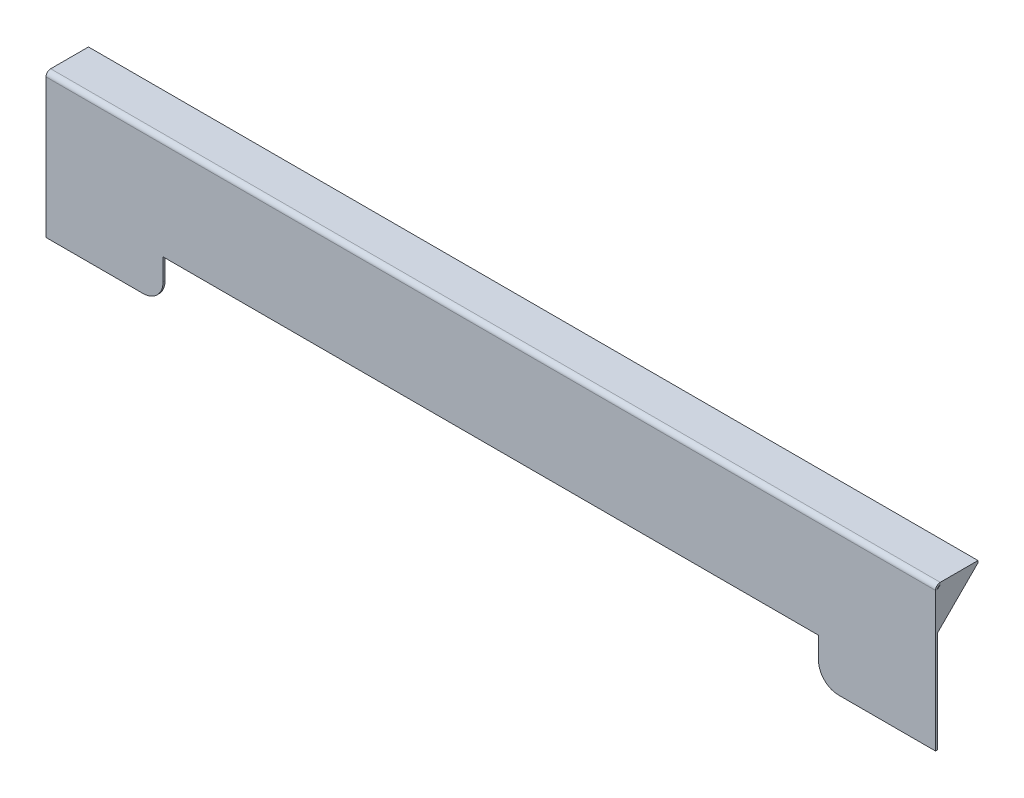
ISO-10303-21;
HEADER;
FILE_DESCRIPTION(('STEP AP214'),'2;1');
FILE_NAME('part.step','',(''),(''),'','','');
FILE_SCHEMA(('AUTOMOTIVE_DESIGN { 1 0 10303 214 1 1 1 1 }'));
ENDSEC;
DATA;
#1=APPLICATION_CONTEXT('core data for automotive mechanical design processes');
#2=APPLICATION_PROTOCOL_DEFINITION('international standard','automotive_design',2000,#1);
#3=PRODUCT_CONTEXT('',#1,'mechanical');
#4=PRODUCT('Part','Part','',(#3));
#5=PRODUCT_RELATED_PRODUCT_CATEGORY('part','',(#4));
#6=PRODUCT_DEFINITION_FORMATION('','',#4);
#7=PRODUCT_DEFINITION_CONTEXT('part definition',#1,'design');
#8=PRODUCT_DEFINITION('design','',#6,#7);
#9=PRODUCT_DEFINITION_SHAPE('','',#8);
#10=(LENGTH_UNIT() NAMED_UNIT(*) SI_UNIT(.MILLI.,.METRE.));
#11=(NAMED_UNIT(*) PLANE_ANGLE_UNIT() SI_UNIT($,.RADIAN.));
#12=(NAMED_UNIT(*) SI_UNIT($,.STERADIAN.) SOLID_ANGLE_UNIT());
#13=UNCERTAINTY_MEASURE_WITH_UNIT(LENGTH_MEASURE(1.E-05),#10,'distance_accuracy_value','');
#14=(GEOMETRIC_REPRESENTATION_CONTEXT(3) GLOBAL_UNCERTAINTY_ASSIGNED_CONTEXT((#13)) GLOBAL_UNIT_ASSIGNED_CONTEXT((#10,
#11,#12)) REPRESENTATION_CONTEXT('',''));
#15=CARTESIAN_POINT('',(0.,0.,0.));
#16=DIRECTION('',(0.,0.,1.));
#17=DIRECTION('',(1.,0.,0.));
#18=AXIS2_PLACEMENT_3D('',#15,#16,#17);
#19=CARTESIAN_POINT('',(0.,59.8,2.09887204035541E-13));
#20=DIRECTION('',(0.,-1.,0.));
#21=DIRECTION('',(0.,0.,-1.));
#22=AXIS2_PLACEMENT_3D('',#19,#20,#21);
#23=PLANE('',#22);
#24=DIRECTION('',(1.,0.,0.));
#25=VECTOR('',#24,1.);
#26=CARTESIAN_POINT('',(-266.,59.8000000000001,-23.5));
#27=LINE('',#26,#25);
#28=CARTESIAN_POINT('',(264.4,59.8000000000001,-23.5));
#29=VERTEX_POINT('',#28);
#30=CARTESIAN_POINT('',(-266.,59.8000000000001,-23.5));
#31=VERTEX_POINT('',#30);
#32=EDGE_CURVE('E200',#29,#31,#27,.F.);
#33=ORIENTED_EDGE('',*,*,#32,.F.);
#34=DIRECTION('',(0.,0.,1.));
#35=VECTOR('',#34,1.);
#36=CARTESIAN_POINT('',(264.4,59.8,-0.900000000000002));
#37=LINE('',#36,#35);
#38=CARTESIAN_POINT('',(264.4,59.8,-0.900000000000002));
#39=VERTEX_POINT('',#38);
#40=EDGE_CURVE('E189',#29,#39,#37,.T.);
#41=ORIENTED_EDGE('',*,*,#40,.T.);
#42=DIRECTION('',(1.,0.,0.));
#43=VECTOR('',#42,1.);
#44=CARTESIAN_POINT('',(-266.,59.8,-0.899999999999998));
#45=LINE('',#44,#43);
#46=CARTESIAN_POINT('',(-266.,59.8,-0.899999999999994));
#47=VERTEX_POINT('',#46);
#48=EDGE_CURVE('E198',#47,#39,#45,.T.);
#49=ORIENTED_EDGE('',*,*,#48,.F.);
#50=DIRECTION('',(0.,0.,-1.));
#51=VECTOR('',#50,1.);
#52=CARTESIAN_POINT('',(-266.,59.8,0.7));
#53=LINE('',#52,#51);
#54=EDGE_CURVE('E351',#31,#47,#53,.F.);
#55=ORIENTED_EDGE('',*,*,#54,.F.);
#56=EDGE_LOOP('',(#33,#41,#49,#55));
#57=FACE_BOUND('',#56,.T.);
#58=ADVANCED_FACE('F62',(#57),#23,.T.);
#59=CARTESIAN_POINT('',(266.,-24.9999999999999,1.9));
#60=DIRECTION('',(1.,0.,0.));
#61=DIRECTION('',(0.,1.,0.));
#62=AXIS2_PLACEMENT_3D('',#59,#60,#61);
#63=PLANE('',#62);
#64=DIRECTION('',(0.,1.,0.));
#65=VECTOR('',#64,1.);
#66=CARTESIAN_POINT('',(266.,-13.,0.7));
#67=LINE('',#66,#65);
#68=CARTESIAN_POINT('',(266.,-24.9999999999999,0.7));
#69=VERTEX_POINT('',#68);
#70=CARTESIAN_POINT('',(266.,35.6000000000004,0.7));
#71=VERTEX_POINT('',#70);
#72=EDGE_CURVE('E273',#69,#71,#67,.T.);
#73=ORIENTED_EDGE('',*,*,#72,.T.);
#74=DIRECTION('',(0.,0.707106781186544,-0.707106781186551));
#75=VECTOR('',#74,1.);
#76=CARTESIAN_POINT('',(266.,59.8000000000001,-23.5));
#77=LINE('',#76,#75);
#78=CARTESIAN_POINT('',(266.,59.8000000000001,-23.5));
#79=VERTEX_POINT('',#78);
#80=EDGE_CURVE('E202',#71,#79,#77,.T.);
#81=ORIENTED_EDGE('',*,*,#80,.T.);
#82=DIRECTION('',(0.,-1.,0.));
#83=VECTOR('',#82,1.);
#84=CARTESIAN_POINT('',(266.,61.0000000000001,-23.5));
#85=LINE('',#84,#83);
#86=CARTESIAN_POINT('',(266.,61.0000000000001,-23.5));
#87=VERTEX_POINT('',#86);
#88=EDGE_CURVE('E235',#87,#79,#85,.T.);
#89=ORIENTED_EDGE('',*,*,#88,.F.);
#90=DIRECTION('',(0.,0.,-1.));
#91=VECTOR('',#90,1.);
#92=CARTESIAN_POINT('',(266.,61.0000000000001,1.43440476904005E-12));
#93=LINE('',#92,#91);
#94=CARTESIAN_POINT('',(266.,61.0000000000001,-0.899999999999987));
#95=VERTEX_POINT('',#94);
#96=EDGE_CURVE('E349',#95,#87,#93,.T.);
#97=ORIENTED_EDGE('',*,*,#96,.F.);
#98=DIRECTION('',(0.,-1.,0.));
#99=VECTOR('',#98,1.);
#100=CARTESIAN_POINT('',(266.,59.8000000000001,-0.899999999999991));
#101=LINE('',#100,#99);
#102=CARTESIAN_POINT('',(266.,59.8,-0.899999999999995));
#103=VERTEX_POINT('',#102);
#104=EDGE_CURVE('E209',#103,#95,#101,.F.);
#105=ORIENTED_EDGE('',*,*,#104,.F.);
#106=DIRECTION('',(0.,-0.707106781186534,0.707106781186561));
#107=VECTOR('',#106,1.);
#108=CARTESIAN_POINT('',(266.,58.2000000000001,0.7));
#109=LINE('',#108,#107);
#110=CARTESIAN_POINT('',(266.,58.2000000000001,0.7));
#111=VERTEX_POINT('',#110);
#112=EDGE_CURVE('E179',#103,#111,#109,.T.);
#113=ORIENTED_EDGE('',*,*,#112,.T.);
#114=DIRECTION('',(0.,0.,1.));
#115=VECTOR('',#114,1.);
#116=CARTESIAN_POINT('',(266.,58.2000000000001,0.69999999999997));
#117=LINE('',#116,#115);
#118=CARTESIAN_POINT('',(266.,58.2000000000001,1.89999999999997));
#119=VERTEX_POINT('',#118);
#120=EDGE_CURVE('E226',#111,#119,#117,.T.);
#121=ORIENTED_EDGE('',*,*,#120,.T.);
#122=DIRECTION('',(0.,1.,0.));
#123=VECTOR('',#122,1.);
#124=CARTESIAN_POINT('',(266.,-24.9999999999999,1.9));
#125=LINE('',#124,#123);
#126=CARTESIAN_POINT('',(266.,-24.9999999999999,1.9));
#127=VERTEX_POINT('',#126);
#128=EDGE_CURVE('E264',#127,#119,#125,.T.);
#129=ORIENTED_EDGE('',*,*,#128,.F.);
#130=DIRECTION('',(0.,0.,1.));
#131=VECTOR('',#130,1.);
#132=CARTESIAN_POINT('',(266.,-24.9999999999999,1.9));
#133=LINE('',#132,#131);
#134=EDGE_CURVE('E296',#69,#127,#133,.T.);
#135=ORIENTED_EDGE('',*,*,#134,.F.);
#136=EDGE_LOOP('',(#73,#81,#89,#97,#105,#113,#121,#129,#135));
#137=FACE_BOUND('',#136,.T.);
#138=ADVANCED_FACE('F332',(#137),#63,.T.);
#139=CARTESIAN_POINT('',(-208.,-13.,1.9));
#140=DIRECTION('',(0.,0.,1.));
#141=DIRECTION('',(1.,0.,0.));
#142=AXIS2_PLACEMENT_3D('',#139,#140,#141);
#143=PLANE('',#142);
#144=ORIENTED_EDGE('',*,*,#128,.T.);
#145=DIRECTION('',(1.,0.,0.));
#146=VECTOR('',#145,1.);
#147=CARTESIAN_POINT('',(266.,58.2000000000001,1.89999999999997));
#148=LINE('',#147,#146);
#149=CARTESIAN_POINT('',(-266.,58.2000000000001,1.9));
#150=VERTEX_POINT('',#149);
#151=EDGE_CURVE('E219',#119,#150,#148,.F.);
#152=ORIENTED_EDGE('',*,*,#151,.T.);
#153=DIRECTION('',(0.,-1.,0.));
#154=VECTOR('',#153,1.);
#155=CARTESIAN_POINT('',(-266.,-25.,1.9));
#156=LINE('',#155,#154);
#157=CARTESIAN_POINT('',(-266.,-25.,1.9));
#158=VERTEX_POINT('',#157);
#159=EDGE_CURVE('E267',#150,#158,#156,.T.);
#160=ORIENTED_EDGE('',*,*,#159,.T.);
#161=DIRECTION('',(1.,0.,0.));
#162=VECTOR('',#161,1.);
#163=CARTESIAN_POINT('',(-266.,-25.,1.9));
#164=LINE('',#163,#162);
#165=CARTESIAN_POINT('',(-208.,-25.,1.9));
#166=VERTEX_POINT('',#165);
#167=EDGE_CURVE('E242',#158,#166,#164,.T.);
#168=ORIENTED_EDGE('',*,*,#167,.T.);
#169=CARTESIAN_POINT('',(-208.,-13.,1.9));
#170=DIRECTION('',(0.,0.,1.));
#171=DIRECTION('',(1.,0.,0.));
#172=AXIS2_PLACEMENT_3D('',#169,#170,#171);
#173=CIRCLE('',#172,12.);
#174=CARTESIAN_POINT('',(-196.,-13.,1.9));
#175=VERTEX_POINT('',#174);
#176=EDGE_CURVE('E245',#166,#175,#173,.T.);
#177=ORIENTED_EDGE('',*,*,#176,.T.);
#178=DIRECTION('',(0.,1.,0.));
#179=VECTOR('',#178,1.);
#180=CARTESIAN_POINT('',(-196.,-13.,1.9));
#181=LINE('',#180,#179);
#182=CARTESIAN_POINT('',(-196.,0.,1.9));
#183=VERTEX_POINT('',#182);
#184=EDGE_CURVE('E249',#175,#183,#181,.T.);
#185=ORIENTED_EDGE('',*,*,#184,.T.);
#186=DIRECTION('',(1.,0.,0.));
#187=VECTOR('',#186,1.);
#188=CARTESIAN_POINT('',(-196.,0.,1.9));
#189=LINE('',#188,#187);
#190=CARTESIAN_POINT('',(196.,0.,1.9));
#191=VERTEX_POINT('',#190);
#192=EDGE_CURVE('E252',#183,#191,#189,.T.);
#193=ORIENTED_EDGE('',*,*,#192,.T.);
#194=DIRECTION('',(0.,-1.,0.));
#195=VECTOR('',#194,1.);
#196=CARTESIAN_POINT('',(196.,-13.,1.9));
#197=LINE('',#196,#195);
#198=CARTESIAN_POINT('',(196.,-13.,1.9));
#199=VERTEX_POINT('',#198);
#200=EDGE_CURVE('E255',#191,#199,#197,.T.);
#201=ORIENTED_EDGE('',*,*,#200,.T.);
#202=CARTESIAN_POINT('',(208.,-13.,1.9));
#203=DIRECTION('',(0.,0.,1.));
#204=DIRECTION('',(-1.,0.,0.));
#205=AXIS2_PLACEMENT_3D('',#202,#203,#204);
#206=CIRCLE('',#205,12.);
#207=CARTESIAN_POINT('',(208.,-25.,1.9));
#208=VERTEX_POINT('',#207);
#209=EDGE_CURVE('E258',#199,#208,#206,.T.);
#210=ORIENTED_EDGE('',*,*,#209,.T.);
#211=DIRECTION('',(1.,0.,0.));
#212=VECTOR('',#211,1.);
#213=CARTESIAN_POINT('',(266.,-24.9999999999999,1.9));
#214=LINE('',#213,#212);
#215=EDGE_CURVE('E261',#208,#127,#214,.T.);
#216=ORIENTED_EDGE('',*,*,#215,.T.);
#217=EDGE_LOOP('',(#144,#152,#160,#168,#177,#185,#193,#201,#210,#216));
#218=FACE_BOUND('',#217,.T.);
#219=ADVANCED_FACE('F312',(#218),#143,.T.);
#220=CARTESIAN_POINT('',(-208.,-13.,0.7));
#221=DIRECTION('',(0.,0.,1.));
#222=DIRECTION('',(1.,0.,0.));
#223=AXIS2_PLACEMENT_3D('',#220,#221,#222);
#224=PLANE('',#223);
#225=DIRECTION('',(0.,-1.,0.));
#226=VECTOR('',#225,1.);
#227=CARTESIAN_POINT('',(264.4,35.6000000000004,0.699999999999993));
#228=LINE('',#227,#226);
#229=CARTESIAN_POINT('',(264.4,58.2000000000001,0.69999999999997));
#230=VERTEX_POINT('',#229);
#231=CARTESIAN_POINT('',(264.4,35.6000000000004,0.699999999999993));
#232=VERTEX_POINT('',#231);
#233=EDGE_CURVE('E192',#230,#232,#228,.T.);
#234=ORIENTED_EDGE('',*,*,#233,.T.);
#235=DIRECTION('',(1.,0.,0.));
#236=VECTOR('',#235,1.);
#237=CARTESIAN_POINT('',(264.4,35.6000000000004,0.699999999999993));
#238=LINE('',#237,#236);
#239=EDGE_CURVE('E184',#232,#71,#238,.T.);
#240=ORIENTED_EDGE('',*,*,#239,.T.);
#241=ORIENTED_EDGE('',*,*,#72,.F.);
#242=DIRECTION('',(1.,0.,0.));
#243=VECTOR('',#242,1.);
#244=CARTESIAN_POINT('',(-208.,-25.,0.7));
#245=LINE('',#244,#243);
#246=CARTESIAN_POINT('',(208.,-25.,0.7));
#247=VERTEX_POINT('',#246);
#248=EDGE_CURVE('E276',#247,#69,#245,.T.);
#249=ORIENTED_EDGE('',*,*,#248,.F.);
#250=CARTESIAN_POINT('',(208.,-13.,0.7));
#251=DIRECTION('',(0.,0.,1.));
#252=DIRECTION('',(1.,0.,0.));
#253=AXIS2_PLACEMENT_3D('',#250,#251,#252);
#254=CIRCLE('',#253,12.);
#255=CARTESIAN_POINT('',(196.,-13.,0.7));
#256=VERTEX_POINT('',#255);
#257=EDGE_CURVE('E279',#256,#247,#254,.T.);
#258=ORIENTED_EDGE('',*,*,#257,.F.);
#259=DIRECTION('',(0.,1.,0.));
#260=VECTOR('',#259,1.);
#261=CARTESIAN_POINT('',(196.,-13.,0.7));
#262=LINE('',#261,#260);
#263=CARTESIAN_POINT('',(196.,0.,0.7));
#264=VERTEX_POINT('',#263);
#265=EDGE_CURVE('E282',#264,#256,#262,.F.);
#266=ORIENTED_EDGE('',*,*,#265,.F.);
#267=DIRECTION('',(1.,0.,0.));
#268=VECTOR('',#267,1.);
#269=CARTESIAN_POINT('',(-208.,0.,0.7));
#270=LINE('',#269,#268);
#271=CARTESIAN_POINT('',(-196.,0.,0.7));
#272=VERTEX_POINT('',#271);
#273=EDGE_CURVE('E285',#272,#264,#270,.T.);
#274=ORIENTED_EDGE('',*,*,#273,.F.);
#275=DIRECTION('',(0.,1.,0.));
#276=VECTOR('',#275,1.);
#277=CARTESIAN_POINT('',(-196.,-13.,0.7));
#278=LINE('',#277,#276);
#279=CARTESIAN_POINT('',(-196.,-13.,0.7));
#280=VERTEX_POINT('',#279);
#281=EDGE_CURVE('E288',#280,#272,#278,.T.);
#282=ORIENTED_EDGE('',*,*,#281,.F.);
#283=CARTESIAN_POINT('',(-208.,-13.,0.7));
#284=DIRECTION('',(0.,0.,1.));
#285=DIRECTION('',(1.,0.,0.));
#286=AXIS2_PLACEMENT_3D('',#283,#284,#285);
#287=CIRCLE('',#286,12.);
#288=CARTESIAN_POINT('',(-208.,-25.,0.7));
#289=VERTEX_POINT('',#288);
#290=EDGE_CURVE('E271',#289,#280,#287,.T.);
#291=ORIENTED_EDGE('',*,*,#290,.F.);
#292=DIRECTION('',(1.,0.,0.));
#293=VECTOR('',#292,1.);
#294=CARTESIAN_POINT('',(-208.,-25.,0.7));
#295=LINE('',#294,#293);
#296=CARTESIAN_POINT('',(-266.,-25.,0.7));
#297=VERTEX_POINT('',#296);
#298=EDGE_CURVE('E239',#297,#289,#295,.T.);
#299=ORIENTED_EDGE('',*,*,#298,.F.);
#300=DIRECTION('',(0.,1.,0.));
#301=VECTOR('',#300,1.);
#302=CARTESIAN_POINT('',(-266.,-13.,0.7));
#303=LINE('',#302,#301);
#304=CARTESIAN_POINT('',(-266.,58.2000000000001,0.69999999999997));
#305=VERTEX_POINT('',#304);
#306=EDGE_CURVE('E246',#305,#297,#303,.F.);
#307=ORIENTED_EDGE('',*,*,#306,.F.);
#308=DIRECTION('',(1.,0.,0.));
#309=VECTOR('',#308,1.);
#310=CARTESIAN_POINT('',(266.,58.2000000000001,0.69999999999997));
#311=LINE('',#310,#309);
#312=EDGE_CURVE('E232',#230,#305,#311,.F.);
#313=ORIENTED_EDGE('',*,*,#312,.F.);
#314=EDGE_LOOP('',(#234,#240,#241,#249,#258,#266,#274,#282,#291,#299,#307,#313));
#315=FACE_BOUND('',#314,.T.);
#316=ADVANCED_FACE('F321',(#315),#224,.F.);
#317=CARTESIAN_POINT('',(-196.,-13.,1.9));
#318=DIRECTION('',(1.,0.,0.));
#319=DIRECTION('',(0.,1.,0.));
#320=AXIS2_PLACEMENT_3D('',#317,#318,#319);
#321=PLANE('',#320);
#322=DIRECTION('',(0.,0.,1.));
#323=VECTOR('',#322,1.);
#324=CARTESIAN_POINT('',(-196.,-13.,1.9));
#325=LINE('',#324,#323);
#326=EDGE_CURVE('E13',#280,#175,#325,.T.);
#327=ORIENTED_EDGE('',*,*,#326,.F.);
#328=ORIENTED_EDGE('',*,*,#281,.T.);
#329=DIRECTION('',(0.,0.,1.));
#330=VECTOR('',#329,1.);
#331=CARTESIAN_POINT('',(-196.,0.,1.9));
#332=LINE('',#331,#330);
#333=EDGE_CURVE('E71',#272,#183,#332,.T.);
#334=ORIENTED_EDGE('',*,*,#333,.T.);
#335=ORIENTED_EDGE('',*,*,#184,.F.);
#336=EDGE_LOOP('',(#327,#328,#334,#335));
#337=FACE_BOUND('',#336,.T.);
#338=ADVANCED_FACE('F306',(#337),#321,.T.);
#339=CARTESIAN_POINT('',(-196.,0.,1.9));
#340=DIRECTION('',(0.,-1.,0.));
#341=DIRECTION('',(1.,0.,0.));
#342=AXIS2_PLACEMENT_3D('',#339,#340,#341);
#343=PLANE('',#342);
#344=ORIENTED_EDGE('',*,*,#333,.F.);
#345=ORIENTED_EDGE('',*,*,#273,.T.);
#346=DIRECTION('',(0.,0.,1.));
#347=VECTOR('',#346,1.);
#348=CARTESIAN_POINT('',(196.,0.,1.9));
#349=LINE('',#348,#347);
#350=EDGE_CURVE('E302',#264,#191,#349,.T.);
#351=ORIENTED_EDGE('',*,*,#350,.T.);
#352=ORIENTED_EDGE('',*,*,#192,.F.);
#353=EDGE_LOOP('',(#344,#345,#351,#352));
#354=FACE_BOUND('',#353,.T.);
#355=ADVANCED_FACE('F315',(#354),#343,.T.);
#356=CARTESIAN_POINT('',(196.,-13.,1.9));
#357=DIRECTION('',(-1.,0.,0.));
#358=DIRECTION('',(0.,-1.,0.));
#359=AXIS2_PLACEMENT_3D('',#356,#357,#358);
#360=PLANE('',#359);
#361=ORIENTED_EDGE('',*,*,#350,.F.);
#362=ORIENTED_EDGE('',*,*,#265,.T.);
#363=DIRECTION('',(0.,0.,1.));
#364=VECTOR('',#363,1.);
#365=CARTESIAN_POINT('',(196.,-13.,1.9));
#366=LINE('',#365,#364);
#367=EDGE_CURVE('E300',#256,#199,#366,.T.);
#368=ORIENTED_EDGE('',*,*,#367,.T.);
#369=ORIENTED_EDGE('',*,*,#200,.F.);
#370=EDGE_LOOP('',(#361,#362,#368,#369));
#371=FACE_BOUND('',#370,.T.);
#372=ADVANCED_FACE('F318',(#371),#360,.T.);
#373=CARTESIAN_POINT('',(208.,-13.,1.9));
#374=DIRECTION('',(0.,0.,1.));
#375=DIRECTION('',(1.,0.,0.));
#376=AXIS2_PLACEMENT_3D('',#373,#374,#375);
#377=CYLINDRICAL_SURFACE('',#376,12.);
#378=ORIENTED_EDGE('',*,*,#367,.F.);
#379=ORIENTED_EDGE('',*,*,#257,.T.);
#380=DIRECTION('',(0.,0.,1.));
#381=VECTOR('',#380,1.);
#382=CARTESIAN_POINT('',(208.,-25.,1.9));
#383=LINE('',#382,#381);
#384=EDGE_CURVE('E298',#247,#208,#383,.T.);
#385=ORIENTED_EDGE('',*,*,#384,.T.);
#386=ORIENTED_EDGE('',*,*,#209,.F.);
#387=EDGE_LOOP('',(#378,#379,#385,#386));
#388=FACE_BOUND('',#387,.T.);
#389=ADVANCED_FACE('F325',(#388),#377,.T.);
#390=CARTESIAN_POINT('',(266.,-24.9999999999999,1.9));
#391=DIRECTION('',(0.,-1.,0.));
#392=DIRECTION('',(1.,0.,0.));
#393=AXIS2_PLACEMENT_3D('',#390,#391,#392);
#394=PLANE('',#393);
#395=ORIENTED_EDGE('',*,*,#384,.F.);
#396=ORIENTED_EDGE('',*,*,#248,.T.);
#397=ORIENTED_EDGE('',*,*,#134,.T.);
#398=ORIENTED_EDGE('',*,*,#215,.F.);
#399=EDGE_LOOP('',(#395,#396,#397,#398));
#400=FACE_BOUND('',#399,.T.);
#401=ADVANCED_FACE('F330',(#400),#394,.T.);
#402=CARTESIAN_POINT('',(-266.,-25.,1.9));
#403=DIRECTION('',(-1.,0.,0.));
#404=DIRECTION('',(0.,-1.,0.));
#405=AXIS2_PLACEMENT_3D('',#402,#403,#404);
#406=PLANE('',#405);
#407=DIRECTION('',(0.,0.,1.));
#408=VECTOR('',#407,1.);
#409=CARTESIAN_POINT('',(-266.,58.2000000000001,0.69999999999997));
#410=LINE('',#409,#408);
#411=EDGE_CURVE('E236',#305,#150,#410,.T.);
#412=ORIENTED_EDGE('',*,*,#411,.F.);
#413=ORIENTED_EDGE('',*,*,#306,.T.);
#414=DIRECTION('',(0.,0.,1.));
#415=VECTOR('',#414,1.);
#416=CARTESIAN_POINT('',(-266.,-25.,1.9));
#417=LINE('',#416,#415);
#418=EDGE_CURVE('E293',#297,#158,#417,.T.);
#419=ORIENTED_EDGE('',*,*,#418,.T.);
#420=ORIENTED_EDGE('',*,*,#159,.F.);
#421=EDGE_LOOP('',(#412,#413,#419,#420));
#422=FACE_BOUND('',#421,.T.);
#423=ADVANCED_FACE('F382',(#422),#406,.T.);
#424=CARTESIAN_POINT('',(-266.,-25.,1.9));
#425=DIRECTION('',(0.,-1.,0.));
#426=DIRECTION('',(1.,0.,0.));
#427=AXIS2_PLACEMENT_3D('',#424,#425,#426);
#428=PLANE('',#427);
#429=ORIENTED_EDGE('',*,*,#418,.F.);
#430=ORIENTED_EDGE('',*,*,#298,.T.);
#431=DIRECTION('',(0.,0.,1.));
#432=VECTOR('',#431,1.);
#433=CARTESIAN_POINT('',(-208.,-25.,1.9));
#434=LINE('',#433,#432);
#435=EDGE_CURVE('E66',#289,#166,#434,.T.);
#436=ORIENTED_EDGE('',*,*,#435,.T.);
#437=ORIENTED_EDGE('',*,*,#167,.F.);
#438=EDGE_LOOP('',(#429,#430,#436,#437));
#439=FACE_BOUND('',#438,.T.);
#440=ADVANCED_FACE('F546',(#439),#428,.T.);
#441=CARTESIAN_POINT('',(-208.,-13.,1.9));
#442=DIRECTION('',(0.,0.,1.));
#443=DIRECTION('',(1.,0.,0.));
#444=AXIS2_PLACEMENT_3D('',#441,#442,#443);
#445=CYLINDRICAL_SURFACE('',#444,12.);
#446=ORIENTED_EDGE('',*,*,#290,.T.);
#447=ORIENTED_EDGE('',*,*,#326,.T.);
#448=ORIENTED_EDGE('',*,*,#176,.F.);
#449=ORIENTED_EDGE('',*,*,#435,.F.);
#450=EDGE_LOOP('',(#446,#447,#448,#449));
#451=FACE_BOUND('',#450,.T.);
#452=ADVANCED_FACE('F64',(#451),#445,.T.);
#453=CARTESIAN_POINT('',(-266.,58.2,-0.9));
#454=DIRECTION('',(-1.,0.,0.));
#455=DIRECTION('',(0.,0.,1.));
#456=AXIS2_PLACEMENT_3D('',#453,#454,#455);
#457=PLANE('',#456);
#458=DIRECTION('',(0.,-1.,0.));
#459=VECTOR('',#458,1.);
#460=CARTESIAN_POINT('',(-266.,61.,-0.899999999999994));
#461=LINE('',#460,#459);
#462=CARTESIAN_POINT('',(-266.,61.,-0.89999999999999));
#463=VERTEX_POINT('',#462);
#464=EDGE_CURVE('E210',#47,#463,#461,.F.);
#465=ORIENTED_EDGE('',*,*,#464,.F.);
#466=CARTESIAN_POINT('',(-266.,58.2,-0.9));
#467=DIRECTION('',(1.,0.,0.));
#468=DIRECTION('',(0.,0.,-1.));
#469=AXIS2_PLACEMENT_3D('',#466,#467,#468);
#470=CIRCLE('',#469,1.59999999999997);
#471=EDGE_CURVE('E208',#305,#47,#470,.F.);
#472=ORIENTED_EDGE('',*,*,#471,.F.);
#473=ORIENTED_EDGE('',*,*,#411,.T.);
#474=CARTESIAN_POINT('',(-266.,58.2,-0.9));
#475=DIRECTION('',(1.,0.,0.));
#476=DIRECTION('',(0.,0.,-1.));
#477=AXIS2_PLACEMENT_3D('',#474,#475,#476);
#478=CIRCLE('',#477,2.79999999999997);
#479=EDGE_CURVE('E222',#150,#463,#478,.F.);
#480=ORIENTED_EDGE('',*,*,#479,.T.);
#481=EDGE_LOOP('',(#465,#472,#473,#480));
#482=FACE_BOUND('',#481,.T.);
#483=ADVANCED_FACE('F375',(#482),#457,.T.);
#484=CARTESIAN_POINT('',(266.,58.2,-0.9));
#485=DIRECTION('',(-1.,0.,0.));
#486=DIRECTION('',(0.,0.,1.));
#487=AXIS2_PLACEMENT_3D('',#484,#485,#486);
#488=PLANE('',#487);
#489=CARTESIAN_POINT('',(266.,58.2,-0.9));
#490=DIRECTION('',(1.,0.,0.));
#491=DIRECTION('',(0.,0.,-1.));
#492=AXIS2_PLACEMENT_3D('',#489,#490,#491);
#493=CIRCLE('',#492,1.59999999999997);
#494=EDGE_CURVE('E233',#103,#111,#493,.T.);
#495=ORIENTED_EDGE('',*,*,#494,.F.);
#496=ORIENTED_EDGE('',*,*,#104,.T.);
#497=CARTESIAN_POINT('',(266.,58.2,-0.9));
#498=DIRECTION('',(1.,0.,0.));
#499=DIRECTION('',(0.,0.,-1.));
#500=AXIS2_PLACEMENT_3D('',#497,#498,#499);
#501=CIRCLE('',#500,2.79999999999997);
#502=EDGE_CURVE('E223',#95,#119,#501,.T.);
#503=ORIENTED_EDGE('',*,*,#502,.T.);
#504=ORIENTED_EDGE('',*,*,#120,.F.);
#505=EDGE_LOOP('',(#495,#496,#503,#504));
#506=FACE_BOUND('',#505,.T.);
#507=ADVANCED_FACE('F372',(#506),#488,.F.);
#508=CARTESIAN_POINT('',(266.,58.2,-0.9));
#509=DIRECTION('',(1.,0.,0.));
#510=DIRECTION('',(0.,1.,0.));
#511=AXIS2_PLACEMENT_3D('',#508,#509,#510);
#512=CYLINDRICAL_SURFACE('',#511,2.79999999999997);
#513=ORIENTED_EDGE('',*,*,#151,.F.);
#514=ORIENTED_EDGE('',*,*,#502,.F.);
#515=DIRECTION('',(1.,0.,0.));
#516=VECTOR('',#515,1.);
#517=CARTESIAN_POINT('',(-266.,61.,-0.899999999999994));
#518=LINE('',#517,#516);
#519=EDGE_CURVE('E213',#95,#463,#518,.F.);
#520=ORIENTED_EDGE('',*,*,#519,.T.);
#521=ORIENTED_EDGE('',*,*,#479,.F.);
#522=EDGE_LOOP('',(#513,#514,#520,#521));
#523=FACE_BOUND('',#522,.T.);
#524=ADVANCED_FACE('F384',(#523),#512,.T.);
#525=CARTESIAN_POINT('',(266.,58.2,-0.9));
#526=DIRECTION('',(1.,0.,0.));
#527=DIRECTION('',(0.,1.,0.));
#528=AXIS2_PLACEMENT_3D('',#525,#526,#527);
#529=CYLINDRICAL_SURFACE('',#528,1.59999999999997);
#530=EDGE_CURVE('E230',#111,#230,#311,.F.);
#531=ORIENTED_EDGE('',*,*,#530,.T.);
#532=ORIENTED_EDGE('',*,*,#312,.T.);
#533=ORIENTED_EDGE('',*,*,#471,.T.);
#534=ORIENTED_EDGE('',*,*,#48,.T.);
#535=DIRECTION('',(1.,0.,0.));
#536=VECTOR('',#535,1.);
#537=CARTESIAN_POINT('',(264.4,59.8,-0.900000000000002));
#538=LINE('',#537,#536);
#539=EDGE_CURVE('E176',#39,#103,#538,.T.);
#540=ORIENTED_EDGE('',*,*,#539,.T.);
#541=ORIENTED_EDGE('',*,*,#494,.T.);
#542=EDGE_LOOP('',(#531,#532,#533,#534,#540,#541));
#543=FACE_BOUND('',#542,.T.);
#544=ADVANCED_FACE('F206',(#543),#529,.F.);
#545=CARTESIAN_POINT('',(-266.,61.,0.700000000000004));
#546=DIRECTION('',(1.,0.,0.));
#547=DIRECTION('',(0.,0.,-1.));
#548=AXIS2_PLACEMENT_3D('',#545,#546,#547);
#549=PLANE('',#548);
#550=ORIENTED_EDGE('',*,*,#464,.T.);
#551=DIRECTION('',(0.,0.,1.));
#552=VECTOR('',#551,1.);
#553=CARTESIAN_POINT('',(-266.,61.,1.43440476904005E-12));
#554=LINE('',#553,#552);
#555=CARTESIAN_POINT('',(-266.,61.0000000000001,-23.5));
#556=VERTEX_POINT('',#555);
#557=EDGE_CURVE('E344',#556,#463,#554,.T.);
#558=ORIENTED_EDGE('',*,*,#557,.F.);
#559=DIRECTION('',(0.,-1.,0.));
#560=VECTOR('',#559,1.);
#561=CARTESIAN_POINT('',(-266.,61.0000000000001,-23.5));
#562=LINE('',#561,#560);
#563=EDGE_CURVE('E341',#556,#31,#562,.T.);
#564=ORIENTED_EDGE('',*,*,#563,.T.);
#565=ORIENTED_EDGE('',*,*,#54,.T.);
#566=EDGE_LOOP('',(#550,#558,#564,#565));
#567=FACE_BOUND('',#566,.T.);
#568=ADVANCED_FACE('F362',(#567),#549,.F.);
#569=CARTESIAN_POINT('',(0.,61.,2.14076981642153E-13));
#570=DIRECTION('',(0.,-1.,0.));
#571=DIRECTION('',(0.,0.,-1.));
#572=AXIS2_PLACEMENT_3D('',#569,#570,#571);
#573=PLANE('',#572);
#574=ORIENTED_EDGE('',*,*,#519,.F.);
#575=ORIENTED_EDGE('',*,*,#96,.T.);
#576=DIRECTION('',(-1.,0.,0.));
#577=VECTOR('',#576,1.);
#578=CARTESIAN_POINT('',(0.,61.0000000000001,-23.5));
#579=LINE('',#578,#577);
#580=EDGE_CURVE('E347',#87,#556,#579,.T.);
#581=ORIENTED_EDGE('',*,*,#580,.T.);
#582=ORIENTED_EDGE('',*,*,#557,.T.);
#583=EDGE_LOOP('',(#574,#575,#581,#582));
#584=FACE_BOUND('',#583,.T.);
#585=ADVANCED_FACE('F364',(#584),#573,.F.);
#586=CARTESIAN_POINT('',(-266.,61.0000000000001,-23.5));
#587=DIRECTION('',(0.,0.,1.));
#588=DIRECTION('',(0.,-1.,0.));
#589=AXIS2_PLACEMENT_3D('',#586,#587,#588);
#590=PLANE('',#589);
#591=EDGE_CURVE('E353',#79,#29,#27,.F.);
#592=ORIENTED_EDGE('',*,*,#591,.T.);
#593=ORIENTED_EDGE('',*,*,#32,.T.);
#594=ORIENTED_EDGE('',*,*,#563,.F.);
#595=ORIENTED_EDGE('',*,*,#580,.F.);
#596=ORIENTED_EDGE('',*,*,#88,.T.);
#597=EDGE_LOOP('',(#592,#593,#594,#595,#596));
#598=FACE_BOUND('',#597,.T.);
#599=ADVANCED_FACE('F358',(#598),#590,.F.);
#600=CARTESIAN_POINT('',(264.4,59.8000000000001,-23.5));
#601=DIRECTION('',(0.,-0.707106781186551,-0.707106781186544));
#602=DIRECTION('',(0.,0.707106781186544,-0.707106781186551));
#603=AXIS2_PLACEMENT_3D('',#600,#601,#602);
#604=PLANE('',#603);
#605=ORIENTED_EDGE('',*,*,#80,.F.);
#606=ORIENTED_EDGE('',*,*,#239,.F.);
#607=DIRECTION('',(0.,0.707106781186544,-0.707106781186551));
#608=VECTOR('',#607,1.);
#609=CARTESIAN_POINT('',(264.4,59.8000000000001,-23.5));
#610=LINE('',#609,#608);
#611=EDGE_CURVE('E86',#232,#29,#610,.T.);
#612=ORIENTED_EDGE('',*,*,#611,.T.);
#613=ORIENTED_EDGE('',*,*,#591,.F.);
#614=EDGE_LOOP('',(#605,#606,#612,#613));
#615=FACE_BOUND('',#614,.T.);
#616=ADVANCED_FACE('F405',(#615),#604,.T.);
#617=CARTESIAN_POINT('',(264.4,58.2000000000001,0.699999999999993));
#618=DIRECTION('',(0.,0.707106781186561,0.707106781186534));
#619=DIRECTION('',(0.,-0.707106781186534,0.707106781186561));
#620=AXIS2_PLACEMENT_3D('',#617,#618,#619);
#621=PLANE('',#620);
#622=ORIENTED_EDGE('',*,*,#112,.F.);
#623=ORIENTED_EDGE('',*,*,#539,.F.);
#624=DIRECTION('',(0.,-0.707106781186534,0.707106781186561));
#625=VECTOR('',#624,1.);
#626=CARTESIAN_POINT('',(264.4,58.2000000000001,0.699999999999993));
#627=LINE('',#626,#625);
#628=EDGE_CURVE('E78',#39,#230,#627,.T.);
#629=ORIENTED_EDGE('',*,*,#628,.T.);
#630=ORIENTED_EDGE('',*,*,#530,.F.);
#631=EDGE_LOOP('',(#622,#623,#629,#630));
#632=FACE_BOUND('',#631,.T.);
#633=ADVANCED_FACE('F177',(#632),#621,.T.);
#634=CARTESIAN_POINT('',(264.4,0.,1.29938235748311E-12));
#635=DIRECTION('',(1.,0.,0.));
#636=DIRECTION('',(0.,0.,-1.));
#637=AXIS2_PLACEMENT_3D('',#634,#635,#636);
#638=PLANE('',#637);
#639=ORIENTED_EDGE('',*,*,#40,.F.);
#640=ORIENTED_EDGE('',*,*,#611,.F.);
#641=ORIENTED_EDGE('',*,*,#233,.F.);
#642=ORIENTED_EDGE('',*,*,#628,.F.);
#643=EDGE_LOOP('',(#639,#640,#641,#642));
#644=FACE_BOUND('',#643,.T.);
#645=ADVANCED_FACE('F188',(#644),#638,.F.);
#646=CLOSED_SHELL('',(#58,#138,#219,#316,#338,#355,#372,#389,#401,#423,#440,#452,#483,#507,#524,
#544,#568,#585,#599,#616,#633,#645));
#647=MANIFOLD_SOLID_BREP('B2',#646);
#648=ADVANCED_BREP_SHAPE_REPRESENTATION('',(#18,#647),#14);
#649=SHAPE_DEFINITION_REPRESENTATION(#9,#648);
ENDSEC;
END-ISO-10303-21;
